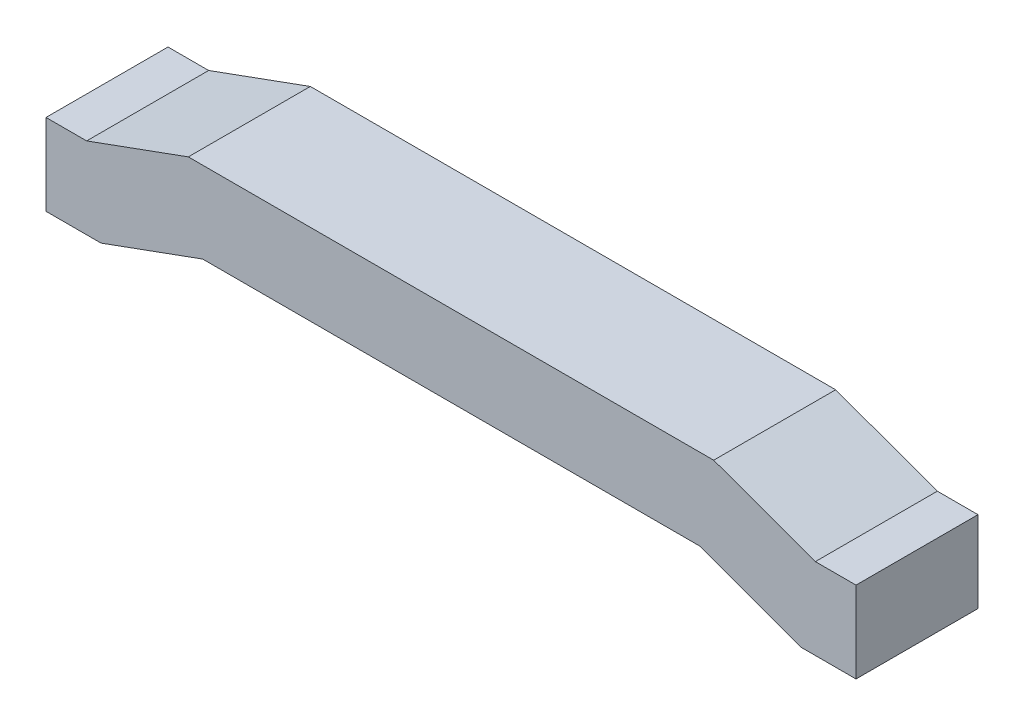
ISO-10303-21;
HEADER;
FILE_DESCRIPTION(('STEP AP214'),'2;1');
FILE_NAME('part.step','',(''),(''),'','','');
FILE_SCHEMA(('AUTOMOTIVE_DESIGN { 1 0 10303 214 1 1 1 1 }'));
ENDSEC;
DATA;
#1=APPLICATION_CONTEXT('core data for automotive mechanical design processes');
#2=APPLICATION_PROTOCOL_DEFINITION('international standard','automotive_design',2000,#1);
#3=PRODUCT_CONTEXT('',#1,'mechanical');
#4=PRODUCT('Part','Part','',(#3));
#5=PRODUCT_RELATED_PRODUCT_CATEGORY('part','',(#4));
#6=PRODUCT_DEFINITION_FORMATION('','',#4);
#7=PRODUCT_DEFINITION_CONTEXT('part definition',#1,'design');
#8=PRODUCT_DEFINITION('design','',#6,#7);
#9=PRODUCT_DEFINITION_SHAPE('','',#8);
#10=(LENGTH_UNIT() NAMED_UNIT(*) SI_UNIT(.MILLI.,.METRE.));
#11=(NAMED_UNIT(*) PLANE_ANGLE_UNIT() SI_UNIT($,.RADIAN.));
#12=(NAMED_UNIT(*) SI_UNIT($,.STERADIAN.) SOLID_ANGLE_UNIT());
#13=UNCERTAINTY_MEASURE_WITH_UNIT(LENGTH_MEASURE(1.E-05),#10,'distance_accuracy_value','');
#14=(GEOMETRIC_REPRESENTATION_CONTEXT(3) GLOBAL_UNCERTAINTY_ASSIGNED_CONTEXT((#13)) GLOBAL_UNIT_ASSIGNED_CONTEXT((#10,
#11,#12)) REPRESENTATION_CONTEXT('',''));
#15=CARTESIAN_POINT('',(0.,0.,0.));
#16=DIRECTION('',(0.,0.,1.));
#17=DIRECTION('',(1.,0.,0.));
#18=AXIS2_PLACEMENT_3D('',#15,#16,#17);
#19=CARTESIAN_POINT('',(-508.,414.834481954094,152.4));
#20=DIRECTION('',(1.,0.,0.));
#21=DIRECTION('',(0.,0.,-1.));
#22=AXIS2_PLACEMENT_3D('',#19,#20,#21);
#23=PLANE('',#22);
#24=DIRECTION('',(0.,-1.,0.));
#25=VECTOR('',#24,1.);
#26=CARTESIAN_POINT('',(-508.,414.834481954094,0.));
#27=LINE('',#26,#25);
#28=CARTESIAN_POINT('',(-508.,414.834481954094,0.));
#29=VERTEX_POINT('',#28);
#30=CARTESIAN_POINT('',(-508.,313.234481954094,0.));
#31=VERTEX_POINT('',#30);
#32=EDGE_CURVE('E155',#29,#31,#27,.T.);
#33=ORIENTED_EDGE('',*,*,#32,.T.);
#34=DIRECTION('',(0.,0.,-1.));
#35=VECTOR('',#34,1.);
#36=CARTESIAN_POINT('',(-508.,313.234481954094,152.4));
#37=LINE('',#36,#35);
#38=CARTESIAN_POINT('',(-508.,313.234481954094,152.4));
#39=VERTEX_POINT('',#38);
#40=EDGE_CURVE('E11',#39,#31,#37,.T.);
#41=ORIENTED_EDGE('',*,*,#40,.F.);
#42=DIRECTION('',(0.,-1.,0.));
#43=VECTOR('',#42,1.);
#44=CARTESIAN_POINT('',(-508.,414.834481954094,152.4));
#45=LINE('',#44,#43);
#46=CARTESIAN_POINT('',(-508.,414.834481954094,152.4));
#47=VERTEX_POINT('',#46);
#48=EDGE_CURVE('E179',#47,#39,#45,.T.);
#49=ORIENTED_EDGE('',*,*,#48,.F.);
#50=DIRECTION('',(0.,0.,-1.));
#51=VECTOR('',#50,1.);
#52=CARTESIAN_POINT('',(-508.,414.834481954094,152.4));
#53=LINE('',#52,#51);
#54=EDGE_CURVE('E151',#47,#29,#53,.T.);
#55=ORIENTED_EDGE('',*,*,#54,.T.);
#56=EDGE_LOOP('',(#33,#41,#49,#55));
#57=FACE_BOUND('',#56,.T.);
#58=ADVANCED_FACE('F36',(#57),#23,.F.);
#59=CARTESIAN_POINT('',(-508.,313.234481954094,152.4));
#60=DIRECTION('',(0.,1.,0.));
#61=DIRECTION('',(0.,0.,1.));
#62=AXIS2_PLACEMENT_3D('',#59,#60,#61);
#63=PLANE('',#62);
#64=DIRECTION('',(1.,0.,0.));
#65=VECTOR('',#64,1.);
#66=CARTESIAN_POINT('',(-508.,313.234481954094,0.));
#67=LINE('',#66,#65);
#68=CARTESIAN_POINT('',(-439.28517876002,313.234481954094,0.));
#69=VERTEX_POINT('',#68);
#70=EDGE_CURVE('E158',#31,#69,#67,.T.);
#71=ORIENTED_EDGE('',*,*,#70,.T.);
#72=DIRECTION('',(0.,0.,-1.));
#73=VECTOR('',#72,1.);
#74=CARTESIAN_POINT('',(-439.28517876002,313.234481954094,152.4));
#75=LINE('',#74,#73);
#76=CARTESIAN_POINT('',(-439.28517876002,313.234481954094,152.4));
#77=VERTEX_POINT('',#76);
#78=EDGE_CURVE('E44',#77,#69,#75,.T.);
#79=ORIENTED_EDGE('',*,*,#78,.F.);
#80=DIRECTION('',(1.,0.,0.));
#81=VECTOR('',#80,1.);
#82=CARTESIAN_POINT('',(-508.,313.234481954094,152.4));
#83=LINE('',#82,#81);
#84=EDGE_CURVE('E107',#39,#77,#83,.T.);
#85=ORIENTED_EDGE('',*,*,#84,.F.);
#86=ORIENTED_EDGE('',*,*,#40,.T.);
#87=EDGE_LOOP('',(#71,#79,#85,#86));
#88=FACE_BOUND('',#87,.T.);
#89=ADVANCED_FACE('F257',(#88),#63,.F.);
#90=CARTESIAN_POINT('',(-439.28517876002,313.234481954094,152.4));
#91=DIRECTION('',(-0.342020143325669,0.939692620785908,0.));
#92=DIRECTION('',(-0.939692620785908,-0.342020143325669,0.));
#93=AXIS2_PLACEMENT_3D('',#90,#91,#92);
#94=PLANE('',#93);
#95=DIRECTION('',(0.939692620785908,0.342020143325669,0.));
#96=VECTOR('',#95,1.);
#97=CARTESIAN_POINT('',(-439.28517876002,313.234481954094,0.));
#98=LINE('',#97,#96);
#99=CARTESIAN_POINT('',(-312.28517876002,359.458701705902,0.));
#100=VERTEX_POINT('',#99);
#101=EDGE_CURVE('E160',#69,#100,#98,.T.);
#102=ORIENTED_EDGE('',*,*,#101,.T.);
#103=DIRECTION('',(0.,0.,-1.));
#104=VECTOR('',#103,1.);
#105=CARTESIAN_POINT('',(-312.28517876002,359.458701705902,152.4));
#106=LINE('',#105,#104);
#107=CARTESIAN_POINT('',(-312.28517876002,359.458701705902,152.4));
#108=VERTEX_POINT('',#107);
#109=EDGE_CURVE('E198',#108,#100,#106,.T.);
#110=ORIENTED_EDGE('',*,*,#109,.F.);
#111=DIRECTION('',(0.939692620785908,0.342020143325669,0.));
#112=VECTOR('',#111,1.);
#113=CARTESIAN_POINT('',(-439.28517876002,313.234481954094,152.4));
#114=LINE('',#113,#112);
#115=EDGE_CURVE('E206',#77,#108,#114,.T.);
#116=ORIENTED_EDGE('',*,*,#115,.F.);
#117=ORIENTED_EDGE('',*,*,#78,.T.);
#118=EDGE_LOOP('',(#102,#110,#116,#117));
#119=FACE_BOUND('',#118,.T.);
#120=ADVANCED_FACE('F204',(#119),#94,.F.);
#121=CARTESIAN_POINT('',(184.406307368992,359.458701705902,152.4));
#122=DIRECTION('',(0.,1.,0.));
#123=DIRECTION('',(0.,0.,1.));
#124=AXIS2_PLACEMENT_3D('',#121,#122,#123);
#125=PLANE('',#124);
#126=DIRECTION('',(1.,0.,0.));
#127=VECTOR('',#126,1.);
#128=CARTESIAN_POINT('',(184.406307368992,359.458701705902,0.));
#129=LINE('',#128,#127);
#130=CARTESIAN_POINT('',(308.166162119811,359.458701705902,0.));
#131=VERTEX_POINT('',#130);
#132=EDGE_CURVE('E163',#100,#131,#129,.T.);
#133=ORIENTED_EDGE('',*,*,#132,.T.);
#134=DIRECTION('',(0.,0.,-1.));
#135=VECTOR('',#134,1.);
#136=CARTESIAN_POINT('',(308.166162119811,359.458701705902,152.4));
#137=LINE('',#136,#135);
#138=CARTESIAN_POINT('',(308.166162119811,359.458701705902,152.4));
#139=VERTEX_POINT('',#138);
#140=EDGE_CURVE('E195',#139,#131,#137,.T.);
#141=ORIENTED_EDGE('',*,*,#140,.F.);
#142=DIRECTION('',(1.,0.,0.));
#143=VECTOR('',#142,1.);
#144=CARTESIAN_POINT('',(-312.28517876002,359.458701705902,152.4));
#145=LINE('',#144,#143);
#146=EDGE_CURVE('E223',#108,#139,#145,.T.);
#147=ORIENTED_EDGE('',*,*,#146,.F.);
#148=ORIENTED_EDGE('',*,*,#109,.T.);
#149=EDGE_LOOP('',(#133,#141,#147,#148));
#150=FACE_BOUND('',#149,.T.);
#151=ADVANCED_FACE('F214',(#150),#125,.F.);
#152=CARTESIAN_POINT('',(435.166162119811,313.234481954094,152.4));
#153=DIRECTION('',(0.342020143325669,0.939692620785908,0.));
#154=DIRECTION('',(-0.939692620785908,0.342020143325669,0.));
#155=AXIS2_PLACEMENT_3D('',#152,#153,#154);
#156=PLANE('',#155);
#157=DIRECTION('',(0.939692620785908,-0.342020143325669,0.));
#158=VECTOR('',#157,1.);
#159=CARTESIAN_POINT('',(435.166162119811,313.234481954094,0.));
#160=LINE('',#159,#158);
#161=CARTESIAN_POINT('',(435.166162119811,313.234481954094,0.));
#162=VERTEX_POINT('',#161);
#163=EDGE_CURVE('E165',#131,#162,#160,.T.);
#164=ORIENTED_EDGE('',*,*,#163,.T.);
#165=DIRECTION('',(0.,0.,-1.));
#166=VECTOR('',#165,1.);
#167=CARTESIAN_POINT('',(435.166162119811,313.234481954094,152.4));
#168=LINE('',#167,#166);
#169=CARTESIAN_POINT('',(435.166162119811,313.234481954094,152.4));
#170=VERTEX_POINT('',#169);
#171=EDGE_CURVE('E192',#170,#162,#168,.T.);
#172=ORIENTED_EDGE('',*,*,#171,.F.);
#173=DIRECTION('',(0.939692620785908,-0.342020143325669,0.));
#174=VECTOR('',#173,1.);
#175=CARTESIAN_POINT('',(435.166162119811,313.234481954094,152.4));
#176=LINE('',#175,#174);
#177=EDGE_CURVE('E220',#139,#170,#176,.T.);
#178=ORIENTED_EDGE('',*,*,#177,.F.);
#179=ORIENTED_EDGE('',*,*,#140,.T.);
#180=EDGE_LOOP('',(#164,#172,#178,#179));
#181=FACE_BOUND('',#180,.T.);
#182=ADVANCED_FACE('F218',(#181),#156,.F.);
#183=CARTESIAN_POINT('',(503.880983359791,313.234481954094,152.4));
#184=DIRECTION('',(0.,1.,0.));
#185=DIRECTION('',(0.,0.,1.));
#186=AXIS2_PLACEMENT_3D('',#183,#184,#185);
#187=PLANE('',#186);
#188=DIRECTION('',(1.,0.,0.));
#189=VECTOR('',#188,1.);
#190=CARTESIAN_POINT('',(503.880983359791,313.234481954094,0.));
#191=LINE('',#190,#189);
#192=CARTESIAN_POINT('',(503.880983359791,313.234481954094,0.));
#193=VERTEX_POINT('',#192);
#194=EDGE_CURVE('E167',#162,#193,#191,.T.);
#195=ORIENTED_EDGE('',*,*,#194,.T.);
#196=DIRECTION('',(0.,0.,-1.));
#197=VECTOR('',#196,1.);
#198=CARTESIAN_POINT('',(503.880983359791,313.234481954094,152.4));
#199=LINE('',#198,#197);
#200=CARTESIAN_POINT('',(503.880983359791,313.234481954094,152.4));
#201=VERTEX_POINT('',#200);
#202=EDGE_CURVE('E189',#201,#193,#199,.T.);
#203=ORIENTED_EDGE('',*,*,#202,.F.);
#204=DIRECTION('',(1.,0.,0.));
#205=VECTOR('',#204,1.);
#206=CARTESIAN_POINT('',(503.880983359791,313.234481954094,152.4));
#207=LINE('',#206,#205);
#208=EDGE_CURVE('E222',#170,#201,#207,.T.);
#209=ORIENTED_EDGE('',*,*,#208,.F.);
#210=ORIENTED_EDGE('',*,*,#171,.T.);
#211=EDGE_LOOP('',(#195,#203,#209,#210));
#212=FACE_BOUND('',#211,.T.);
#213=ADVANCED_FACE('F270',(#212),#187,.F.);
#214=CARTESIAN_POINT('',(503.880983359791,414.834481954094,152.4));
#215=DIRECTION('',(-1.,0.,0.));
#216=DIRECTION('',(0.,0.,1.));
#217=AXIS2_PLACEMENT_3D('',#214,#215,#216);
#218=PLANE('',#217);
#219=DIRECTION('',(0.,1.,0.));
#220=VECTOR('',#219,1.);
#221=CARTESIAN_POINT('',(503.880983359791,414.834481954094,0.));
#222=LINE('',#221,#220);
#223=CARTESIAN_POINT('',(503.880983359791,414.834481954094,0.));
#224=VERTEX_POINT('',#223);
#225=EDGE_CURVE('E169',#193,#224,#222,.T.);
#226=ORIENTED_EDGE('',*,*,#225,.T.);
#227=DIRECTION('',(0.,0.,-1.));
#228=VECTOR('',#227,1.);
#229=CARTESIAN_POINT('',(503.880983359791,414.834481954094,152.4));
#230=LINE('',#229,#228);
#231=CARTESIAN_POINT('',(503.880983359791,414.834481954094,152.4));
#232=VERTEX_POINT('',#231);
#233=EDGE_CURVE('E186',#232,#224,#230,.T.);
#234=ORIENTED_EDGE('',*,*,#233,.F.);
#235=DIRECTION('',(0.,1.,0.));
#236=VECTOR('',#235,1.);
#237=CARTESIAN_POINT('',(503.880983359791,414.834481954094,152.4));
#238=LINE('',#237,#236);
#239=EDGE_CURVE('E225',#201,#232,#238,.T.);
#240=ORIENTED_EDGE('',*,*,#239,.F.);
#241=ORIENTED_EDGE('',*,*,#202,.T.);
#242=EDGE_LOOP('',(#226,#234,#240,#241));
#243=FACE_BOUND('',#242,.T.);
#244=ADVANCED_FACE('F273',(#243),#218,.F.);
#245=CARTESIAN_POINT('',(503.880983359791,414.834481954094,152.4));
#246=DIRECTION('',(0.,-1.,0.));
#247=DIRECTION('',(0.,0.,-1.));
#248=AXIS2_PLACEMENT_3D('',#245,#246,#247);
#249=PLANE('',#248);
#250=DIRECTION('',(-1.,0.,0.));
#251=VECTOR('',#250,1.);
#252=CARTESIAN_POINT('',(503.880983359791,414.834481954094,0.));
#253=LINE('',#252,#251);
#254=CARTESIAN_POINT('',(453.080983359791,414.834481954094,0.));
#255=VERTEX_POINT('',#254);
#256=EDGE_CURVE('E171',#224,#255,#253,.T.);
#257=ORIENTED_EDGE('',*,*,#256,.T.);
#258=DIRECTION('',(0.,0.,-1.));
#259=VECTOR('',#258,1.);
#260=CARTESIAN_POINT('',(453.080983359791,414.834481954094,152.4));
#261=LINE('',#260,#259);
#262=CARTESIAN_POINT('',(453.080983359791,414.834481954094,152.4));
#263=VERTEX_POINT('',#262);
#264=EDGE_CURVE('E183',#263,#255,#261,.T.);
#265=ORIENTED_EDGE('',*,*,#264,.F.);
#266=DIRECTION('',(-1.,0.,0.));
#267=VECTOR('',#266,1.);
#268=CARTESIAN_POINT('',(503.880983359791,414.834481954094,152.4));
#269=LINE('',#268,#267);
#270=EDGE_CURVE('E231',#232,#263,#269,.T.);
#271=ORIENTED_EDGE('',*,*,#270,.F.);
#272=ORIENTED_EDGE('',*,*,#233,.T.);
#273=EDGE_LOOP('',(#257,#265,#271,#272));
#274=FACE_BOUND('',#273,.T.);
#275=ADVANCED_FACE('F237',(#274),#249,.F.);
#276=CARTESIAN_POINT('',(453.080983359791,414.834481954094,152.4));
#277=DIRECTION('',(-0.342020143325669,-0.939692620785908,0.));
#278=DIRECTION('',(0.939692620785908,-0.342020143325669,0.));
#279=AXIS2_PLACEMENT_3D('',#276,#277,#278);
#280=PLANE('',#279);
#281=DIRECTION('',(-0.939692620785908,0.342020143325669,0.));
#282=VECTOR('',#281,1.);
#283=CARTESIAN_POINT('',(453.080983359791,414.834481954094,0.));
#284=LINE('',#283,#282);
#285=CARTESIAN_POINT('',(326.080983359791,461.058701705902,0.));
#286=VERTEX_POINT('',#285);
#287=EDGE_CURVE('E173',#255,#286,#284,.T.);
#288=ORIENTED_EDGE('',*,*,#287,.T.);
#289=DIRECTION('',(0.,0.,-1.));
#290=VECTOR('',#289,1.);
#291=CARTESIAN_POINT('',(326.080983359791,461.058701705902,152.4));
#292=LINE('',#291,#290);
#293=CARTESIAN_POINT('',(326.080983359791,461.058701705902,152.4));
#294=VERTEX_POINT('',#293);
#295=EDGE_CURVE('E146',#294,#286,#292,.T.);
#296=ORIENTED_EDGE('',*,*,#295,.F.);
#297=DIRECTION('',(-0.939692620785908,0.342020143325669,0.));
#298=VECTOR('',#297,1.);
#299=CARTESIAN_POINT('',(453.080983359791,414.834481954094,152.4));
#300=LINE('',#299,#298);
#301=EDGE_CURVE('E138',#263,#294,#300,.T.);
#302=ORIENTED_EDGE('',*,*,#301,.F.);
#303=ORIENTED_EDGE('',*,*,#264,.T.);
#304=EDGE_LOOP('',(#288,#296,#302,#303));
#305=FACE_BOUND('',#304,.T.);
#306=ADVANCED_FACE('F241',(#305),#280,.F.);
#307=CARTESIAN_POINT('',(-330.2,461.058701705902,152.4));
#308=DIRECTION('',(0.,-1.,0.));
#309=DIRECTION('',(0.,0.,-1.));
#310=AXIS2_PLACEMENT_3D('',#307,#308,#309);
#311=PLANE('',#310);
#312=DIRECTION('',(-1.,0.,0.));
#313=VECTOR('',#312,1.);
#314=CARTESIAN_POINT('',(-330.2,461.058701705902,0.));
#315=LINE('',#314,#313);
#316=CARTESIAN_POINT('',(-330.2,461.058701705902,0.));
#317=VERTEX_POINT('',#316);
#318=EDGE_CURVE('E145',#286,#317,#315,.T.);
#319=ORIENTED_EDGE('',*,*,#318,.T.);
#320=DIRECTION('',(0.,0.,-1.));
#321=VECTOR('',#320,1.);
#322=CARTESIAN_POINT('',(-330.2,461.058701705902,152.4));
#323=LINE('',#322,#321);
#324=CARTESIAN_POINT('',(-330.2,461.058701705902,152.4));
#325=VERTEX_POINT('',#324);
#326=EDGE_CURVE('E143',#325,#317,#323,.T.);
#327=ORIENTED_EDGE('',*,*,#326,.F.);
#328=DIRECTION('',(-1.,0.,0.));
#329=VECTOR('',#328,1.);
#330=CARTESIAN_POINT('',(184.406307368992,461.058701705902,152.4));
#331=LINE('',#330,#329);
#332=EDGE_CURVE('E132',#294,#325,#331,.T.);
#333=ORIENTED_EDGE('',*,*,#332,.F.);
#334=ORIENTED_EDGE('',*,*,#295,.T.);
#335=EDGE_LOOP('',(#319,#327,#333,#334));
#336=FACE_BOUND('',#335,.T.);
#337=ADVANCED_FACE('F144',(#336),#311,.F.);
#338=CARTESIAN_POINT('',(-457.2,414.834481954094,152.4));
#339=DIRECTION('',(0.342020143325669,-0.939692620785908,0.));
#340=DIRECTION('',(0.939692620785908,0.342020143325669,0.));
#341=AXIS2_PLACEMENT_3D('',#338,#339,#340);
#342=PLANE('',#341);
#343=DIRECTION('',(-0.939692620785908,-0.342020143325669,0.));
#344=VECTOR('',#343,1.);
#345=CARTESIAN_POINT('',(-457.2,414.834481954094,0.));
#346=LINE('',#345,#344);
#347=CARTESIAN_POINT('',(-457.2,414.834481954094,0.));
#348=VERTEX_POINT('',#347);
#349=EDGE_CURVE('E93',#317,#348,#346,.T.);
#350=ORIENTED_EDGE('',*,*,#349,.T.);
#351=DIRECTION('',(0.,0.,-1.));
#352=VECTOR('',#351,1.);
#353=CARTESIAN_POINT('',(-457.2,414.834481954094,152.4));
#354=LINE('',#353,#352);
#355=CARTESIAN_POINT('',(-457.2,414.834481954094,152.4));
#356=VERTEX_POINT('',#355);
#357=EDGE_CURVE('E147',#356,#348,#354,.T.);
#358=ORIENTED_EDGE('',*,*,#357,.F.);
#359=DIRECTION('',(-0.939692620785908,-0.342020143325669,0.));
#360=VECTOR('',#359,1.);
#361=CARTESIAN_POINT('',(-457.2,414.834481954094,152.4));
#362=LINE('',#361,#360);
#363=EDGE_CURVE('E136',#325,#356,#362,.T.);
#364=ORIENTED_EDGE('',*,*,#363,.F.);
#365=ORIENTED_EDGE('',*,*,#326,.T.);
#366=EDGE_LOOP('',(#350,#358,#364,#365));
#367=FACE_BOUND('',#366,.T.);
#368=ADVANCED_FACE('F149',(#367),#342,.F.);
#369=CARTESIAN_POINT('',(-508.,414.834481954094,152.4));
#370=DIRECTION('',(0.,-1.,0.));
#371=DIRECTION('',(0.,0.,-1.));
#372=AXIS2_PLACEMENT_3D('',#369,#370,#371);
#373=PLANE('',#372);
#374=DIRECTION('',(-1.,0.,0.));
#375=VECTOR('',#374,1.);
#376=CARTESIAN_POINT('',(-508.,414.834481954094,0.));
#377=LINE('',#376,#375);
#378=EDGE_CURVE('E99',#348,#29,#377,.T.);
#379=ORIENTED_EDGE('',*,*,#378,.T.);
#380=ORIENTED_EDGE('',*,*,#54,.F.);
#381=DIRECTION('',(-1.,0.,0.));
#382=VECTOR('',#381,1.);
#383=CARTESIAN_POINT('',(-508.,414.834481954094,152.4));
#384=LINE('',#383,#382);
#385=EDGE_CURVE('E52',#356,#47,#384,.T.);
#386=ORIENTED_EDGE('',*,*,#385,.F.);
#387=ORIENTED_EDGE('',*,*,#357,.T.);
#388=EDGE_LOOP('',(#379,#380,#386,#387));
#389=FACE_BOUND('',#388,.T.);
#390=ADVANCED_FACE('F246',(#389),#373,.F.);
#391=CARTESIAN_POINT('',(0.,0.,152.4));
#392=DIRECTION('',(0.,0.,1.));
#393=DIRECTION('',(1.,0.,0.));
#394=AXIS2_PLACEMENT_3D('',#391,#392,#393);
#395=PLANE('',#394);
#396=ORIENTED_EDGE('',*,*,#48,.T.);
#397=ORIENTED_EDGE('',*,*,#84,.T.);
#398=ORIENTED_EDGE('',*,*,#115,.T.);
#399=ORIENTED_EDGE('',*,*,#146,.T.);
#400=ORIENTED_EDGE('',*,*,#177,.T.);
#401=ORIENTED_EDGE('',*,*,#208,.T.);
#402=ORIENTED_EDGE('',*,*,#239,.T.);
#403=ORIENTED_EDGE('',*,*,#270,.T.);
#404=ORIENTED_EDGE('',*,*,#301,.T.);
#405=ORIENTED_EDGE('',*,*,#332,.T.);
#406=ORIENTED_EDGE('',*,*,#363,.T.);
#407=ORIENTED_EDGE('',*,*,#385,.T.);
#408=EDGE_LOOP('',(#396,#397,#398,#399,#400,#401,#402,#403,#404,#405,#406,#407));
#409=FACE_BOUND('',#408,.T.);
#410=ADVANCED_FACE('F134',(#409),#395,.T.);
#411=CARTESIAN_POINT('',(0.,0.,0.));
#412=DIRECTION('',(0.,0.,1.));
#413=DIRECTION('',(1.,0.,0.));
#414=AXIS2_PLACEMENT_3D('',#411,#412,#413);
#415=PLANE('',#414);
#416=ORIENTED_EDGE('',*,*,#32,.F.);
#417=ORIENTED_EDGE('',*,*,#378,.F.);
#418=ORIENTED_EDGE('',*,*,#349,.F.);
#419=ORIENTED_EDGE('',*,*,#318,.F.);
#420=ORIENTED_EDGE('',*,*,#287,.F.);
#421=ORIENTED_EDGE('',*,*,#256,.F.);
#422=ORIENTED_EDGE('',*,*,#225,.F.);
#423=ORIENTED_EDGE('',*,*,#194,.F.);
#424=ORIENTED_EDGE('',*,*,#163,.F.);
#425=ORIENTED_EDGE('',*,*,#132,.F.);
#426=ORIENTED_EDGE('',*,*,#101,.F.);
#427=ORIENTED_EDGE('',*,*,#70,.F.);
#428=EDGE_LOOP('',(#416,#417,#418,#419,#420,#421,#422,#423,#424,#425,#426,#427));
#429=FACE_BOUND('',#428,.T.);
#430=ADVANCED_FACE('F209',(#429),#415,.F.);
#431=CLOSED_SHELL('',(#58,#89,#120,#151,#182,#213,#244,#275,#306,#337,#368,#390,#410,#430));
#432=MANIFOLD_SOLID_BREP('B2',#431);
#433=ADVANCED_BREP_SHAPE_REPRESENTATION('',(#18,#432),#14);
#434=SHAPE_DEFINITION_REPRESENTATION(#9,#433);
ENDSEC;
END-ISO-10303-21;
